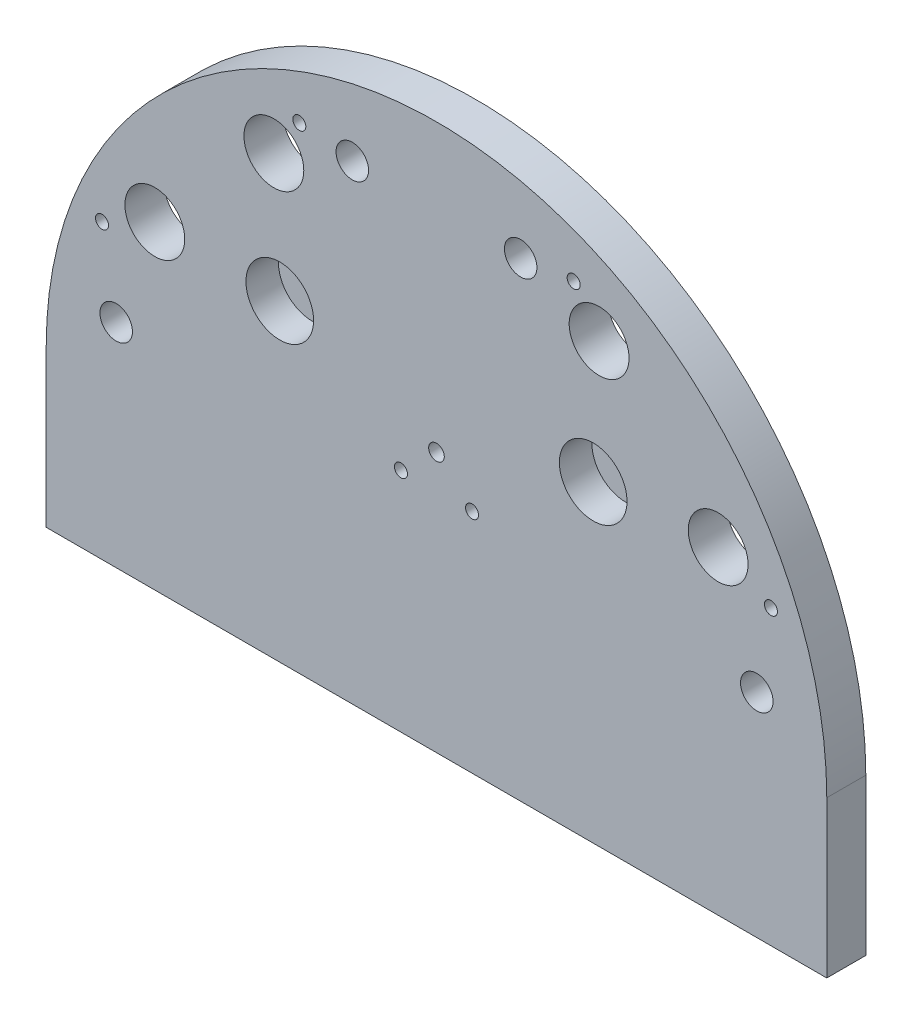
ISO-10303-21;
HEADER;
FILE_DESCRIPTION(('STEP AP214'),'2;1');
FILE_NAME('part.step','',(''),(''),'','','');
FILE_SCHEMA(('AUTOMOTIVE_DESIGN { 1 0 10303 214 1 1 1 1 }'));
ENDSEC;
DATA;
#1=APPLICATION_CONTEXT('core data for automotive mechanical design processes');
#2=APPLICATION_PROTOCOL_DEFINITION('international standard','automotive_design',2000,#1);
#3=PRODUCT_CONTEXT('',#1,'mechanical');
#4=PRODUCT('Part','Part','',(#3));
#5=PRODUCT_RELATED_PRODUCT_CATEGORY('part','',(#4));
#6=PRODUCT_DEFINITION_FORMATION('','',#4);
#7=PRODUCT_DEFINITION_CONTEXT('part definition',#1,'design');
#8=PRODUCT_DEFINITION('design','',#6,#7);
#9=PRODUCT_DEFINITION_SHAPE('','',#8);
#10=(LENGTH_UNIT() NAMED_UNIT(*) SI_UNIT(.MILLI.,.METRE.));
#11=(NAMED_UNIT(*) PLANE_ANGLE_UNIT() SI_UNIT($,.RADIAN.));
#12=(NAMED_UNIT(*) SI_UNIT($,.STERADIAN.) SOLID_ANGLE_UNIT());
#13=UNCERTAINTY_MEASURE_WITH_UNIT(LENGTH_MEASURE(1.E-05),#10,'distance_accuracy_value','');
#14=(GEOMETRIC_REPRESENTATION_CONTEXT(3) GLOBAL_UNCERTAINTY_ASSIGNED_CONTEXT((#13)) GLOBAL_UNIT_ASSIGNED_CONTEXT((#10,
#11,#12)) REPRESENTATION_CONTEXT('',''));
#15=CARTESIAN_POINT('',(0.,0.,0.));
#16=DIRECTION('',(0.,0.,1.));
#17=DIRECTION('',(1.,0.,0.));
#18=AXIS2_PLACEMENT_3D('',#15,#16,#17);
#19=CARTESIAN_POINT('',(120.47,120.47,-0.001000000000001));
#20=DIRECTION('',(0.,0.,1.));
#21=DIRECTION('',(1.,0.,0.));
#22=AXIS2_PLACEMENT_3D('',#19,#20,#21);
#23=CYLINDRICAL_SURFACE('',#22,26.);
#24=CARTESIAN_POINT('',(120.47,120.47,30.));
#25=DIRECTION('',(0.,0.,1.));
#26=DIRECTION('',(-1.,0.,0.));
#27=AXIS2_PLACEMENT_3D('',#24,#25,#26);
#28=CIRCLE('',#27,26.);
#29=CARTESIAN_POINT('',(94.47,120.47,30.));
#30=VERTEX_POINT('',#29);
#31=EDGE_CURVE('E348',#30,#30,#28,.T.);
#32=ORIENTED_EDGE('',*,*,#31,.T.);
#33=EDGE_LOOP('',(#32));
#34=FACE_BOUND('',#33,.T.);
#35=CARTESIAN_POINT('',(120.47,120.47,5.));
#36=DIRECTION('',(0.,0.,-1.));
#37=DIRECTION('',(-1.,0.,0.));
#38=AXIS2_PLACEMENT_3D('',#35,#36,#37);
#39=CIRCLE('',#38,26.);
#40=CARTESIAN_POINT('',(94.47,120.47,5.));
#41=VERTEX_POINT('',#40);
#42=EDGE_CURVE('E11',#41,#41,#39,.F.);
#43=ORIENTED_EDGE('',*,*,#42,.F.);
#44=EDGE_LOOP('',(#43));
#45=FACE_BOUND('',#44,.T.);
#46=ADVANCED_FACE('F41',(#34,#45),#23,.F.);
#47=CARTESIAN_POINT('',(-120.47,120.47,-0.001000000000001));
#48=DIRECTION('',(0.,0.,1.));
#49=DIRECTION('',(1.,0.,0.));
#50=AXIS2_PLACEMENT_3D('',#47,#48,#49);
#51=CYLINDRICAL_SURFACE('',#50,26.);
#52=CARTESIAN_POINT('',(-120.47,120.47,30.));
#53=DIRECTION('',(0.,0.,1.));
#54=DIRECTION('',(1.,0.,0.));
#55=AXIS2_PLACEMENT_3D('',#52,#53,#54);
#56=CIRCLE('',#55,26.);
#57=CARTESIAN_POINT('',(-94.47,120.47,30.));
#58=VERTEX_POINT('',#57);
#59=EDGE_CURVE('E93',#58,#58,#56,.T.);
#60=ORIENTED_EDGE('',*,*,#59,.T.);
#61=EDGE_LOOP('',(#60));
#62=FACE_BOUND('',#61,.T.);
#63=CARTESIAN_POINT('',(-120.47,120.47,5.));
#64=DIRECTION('',(0.,0.,-1.));
#65=DIRECTION('',(-1.,0.,0.));
#66=AXIS2_PLACEMENT_3D('',#63,#64,#65);
#67=CIRCLE('',#66,26.);
#68=CARTESIAN_POINT('',(-146.47,120.47,5.));
#69=VERTEX_POINT('',#68);
#70=EDGE_CURVE('E51',#69,#69,#67,.F.);
#71=ORIENTED_EDGE('',*,*,#70,.F.);
#72=EDGE_LOOP('',(#71));
#73=FACE_BOUND('',#72,.T.);
#74=ADVANCED_FACE('F146',(#62,#73),#51,.F.);
#75=CARTESIAN_POINT('',(0.,0.,30.));
#76=DIRECTION('',(0.,0.,-1.));
#77=DIRECTION('',(-1.,0.,0.));
#78=AXIS2_PLACEMENT_3D('',#75,#76,#77);
#79=CYLINDRICAL_SURFACE('',#78,300.);
#80=CARTESIAN_POINT('',(0.,0.,30.));
#81=DIRECTION('',(0.,0.,1.));
#82=DIRECTION('',(1.,0.,0.));
#83=AXIS2_PLACEMENT_3D('',#80,#81,#82);
#84=CIRCLE('',#83,300.);
#85=CARTESIAN_POINT('',(300.,0.,30.));
#86=VERTEX_POINT('',#85);
#87=CARTESIAN_POINT('',(-300.,0.,30.));
#88=VERTEX_POINT('',#87);
#89=EDGE_CURVE('E99',#86,#88,#84,.T.);
#90=ORIENTED_EDGE('',*,*,#89,.F.);
#91=DIRECTION('',(0.,0.,1.));
#92=VECTOR('',#91,1.);
#93=CARTESIAN_POINT('',(300.,0.,-611.882341631134));
#94=LINE('',#93,#92);
#95=CARTESIAN_POINT('',(300.,0.,0.));
#96=VERTEX_POINT('',#95);
#97=EDGE_CURVE('E336',#96,#86,#94,.T.);
#98=ORIENTED_EDGE('',*,*,#97,.F.);
#99=CARTESIAN_POINT('',(0.,0.,0.));
#100=DIRECTION('',(0.,0.,1.));
#101=DIRECTION('',(1.,0.,0.));
#102=AXIS2_PLACEMENT_3D('',#99,#100,#101);
#103=CIRCLE('',#102,300.);
#104=CARTESIAN_POINT('',(-300.,0.,0.));
#105=VERTEX_POINT('',#104);
#106=EDGE_CURVE('E100',#96,#105,#103,.T.);
#107=ORIENTED_EDGE('',*,*,#106,.T.);
#108=DIRECTION('',(0.,0.,1.));
#109=VECTOR('',#108,1.);
#110=CARTESIAN_POINT('',(-300.,0.,-611.882341631134));
#111=LINE('',#110,#109);
#112=EDGE_CURVE('E83',#105,#88,#111,.T.);
#113=ORIENTED_EDGE('',*,*,#112,.T.);
#114=EDGE_LOOP('',(#90,#98,#107,#113));
#115=FACE_BOUND('',#114,.T.);
#116=ADVANCED_FACE('F97',(#115),#79,.T.);
#117=CARTESIAN_POINT('',(216.50635094611,124.999999999999,30.));
#118=DIRECTION('',(0.,0.,-1.));
#119=DIRECTION('',(-1.,0.,0.));
#120=AXIS2_PLACEMENT_3D('',#117,#118,#119);
#121=CYLINDRICAL_SURFACE('',#120,23.);
#122=CARTESIAN_POINT('',(216.50635094611,124.999999999999,30.));
#123=DIRECTION('',(0.,0.,1.));
#124=DIRECTION('',(1.,0.,0.));
#125=AXIS2_PLACEMENT_3D('',#122,#123,#124);
#126=CIRCLE('',#125,23.);
#127=CARTESIAN_POINT('',(239.50635094611,124.999999999999,30.));
#128=VERTEX_POINT('',#127);
#129=EDGE_CURVE('E110',#128,#128,#126,.F.);
#130=ORIENTED_EDGE('',*,*,#129,.F.);
#131=EDGE_LOOP('',(#130));
#132=FACE_BOUND('',#131,.T.);
#133=CARTESIAN_POINT('',(216.50635094611,124.999999999999,0.));
#134=DIRECTION('',(0.,0.,1.));
#135=DIRECTION('',(1.,0.,0.));
#136=AXIS2_PLACEMENT_3D('',#133,#134,#135);
#137=CIRCLE('',#136,23.);
#138=CARTESIAN_POINT('',(239.50635094611,124.999999999999,0.));
#139=VERTEX_POINT('',#138);
#140=EDGE_CURVE('E130',#139,#139,#137,.F.);
#141=ORIENTED_EDGE('',*,*,#140,.T.);
#142=EDGE_LOOP('',(#141));
#143=FACE_BOUND('',#142,.T.);
#144=ADVANCED_FACE('F154',(#132,#143),#121,.F.);
#145=CARTESIAN_POINT('',(-125.,216.50635094611,30.));
#146=DIRECTION('',(0.,0.,-1.));
#147=DIRECTION('',(-1.,0.,0.));
#148=AXIS2_PLACEMENT_3D('',#145,#146,#147);
#149=CYLINDRICAL_SURFACE('',#148,23.);
#150=CARTESIAN_POINT('',(-125.,216.50635094611,30.));
#151=DIRECTION('',(0.,0.,1.));
#152=DIRECTION('',(1.,0.,0.));
#153=AXIS2_PLACEMENT_3D('',#150,#151,#152);
#154=CIRCLE('',#153,23.);
#155=CARTESIAN_POINT('',(-102.,216.50635094611,30.));
#156=VERTEX_POINT('',#155);
#157=EDGE_CURVE('E117',#156,#156,#154,.T.);
#158=ORIENTED_EDGE('',*,*,#157,.T.);
#159=EDGE_LOOP('',(#158));
#160=FACE_BOUND('',#159,.T.);
#161=CARTESIAN_POINT('',(-125.,216.50635094611,0.));
#162=DIRECTION('',(0.,0.,1.));
#163=DIRECTION('',(1.,0.,0.));
#164=AXIS2_PLACEMENT_3D('',#161,#162,#163);
#165=CIRCLE('',#164,23.);
#166=CARTESIAN_POINT('',(-102.,216.50635094611,0.));
#167=VERTEX_POINT('',#166);
#168=EDGE_CURVE('E125',#167,#167,#165,.T.);
#169=ORIENTED_EDGE('',*,*,#168,.F.);
#170=EDGE_LOOP('',(#169));
#171=FACE_BOUND('',#170,.T.);
#172=ADVANCED_FACE('F224',(#160,#171),#149,.F.);
#173=CARTESIAN_POINT('',(-216.50635094611,124.999999999999,30.));
#174=DIRECTION('',(0.,0.,-1.));
#175=DIRECTION('',(-1.,0.,0.));
#176=AXIS2_PLACEMENT_3D('',#173,#174,#175);
#177=CYLINDRICAL_SURFACE('',#176,22.9999999999999);
#178=CARTESIAN_POINT('',(-216.50635094611,124.999999999999,30.));
#179=DIRECTION('',(0.,0.,1.));
#180=DIRECTION('',(1.,0.,0.));
#181=AXIS2_PLACEMENT_3D('',#178,#179,#180);
#182=CIRCLE('',#181,22.9999999999999);
#183=CARTESIAN_POINT('',(-193.50635094611,124.999999999999,30.));
#184=VERTEX_POINT('',#183);
#185=EDGE_CURVE('E139',#184,#184,#182,.T.);
#186=ORIENTED_EDGE('',*,*,#185,.T.);
#187=EDGE_LOOP('',(#186));
#188=FACE_BOUND('',#187,.T.);
#189=CARTESIAN_POINT('',(-216.50635094611,124.999999999999,0.));
#190=DIRECTION('',(0.,0.,1.));
#191=DIRECTION('',(1.,0.,0.));
#192=AXIS2_PLACEMENT_3D('',#189,#190,#191);
#193=CIRCLE('',#192,22.9999999999999);
#194=CARTESIAN_POINT('',(-193.50635094611,124.999999999999,0.));
#195=VERTEX_POINT('',#194);
#196=EDGE_CURVE('E121',#195,#195,#193,.T.);
#197=ORIENTED_EDGE('',*,*,#196,.F.);
#198=EDGE_LOOP('',(#197));
#199=FACE_BOUND('',#198,.T.);
#200=ADVANCED_FACE('F43',(#188,#199),#177,.F.);
#201=CARTESIAN_POINT('',(125.,216.50635094611,30.));
#202=DIRECTION('',(0.,0.,-1.));
#203=DIRECTION('',(-1.,0.,0.));
#204=AXIS2_PLACEMENT_3D('',#201,#202,#203);
#205=CYLINDRICAL_SURFACE('',#204,23.);
#206=CARTESIAN_POINT('',(125.,216.50635094611,30.));
#207=DIRECTION('',(0.,0.,1.));
#208=DIRECTION('',(1.,0.,0.));
#209=AXIS2_PLACEMENT_3D('',#206,#207,#208);
#210=CIRCLE('',#209,23.);
#211=CARTESIAN_POINT('',(148.,216.50635094611,30.));
#212=VERTEX_POINT('',#211);
#213=EDGE_CURVE('E109',#212,#212,#210,.F.);
#214=ORIENTED_EDGE('',*,*,#213,.F.);
#215=EDGE_LOOP('',(#214));
#216=FACE_BOUND('',#215,.T.);
#217=CARTESIAN_POINT('',(125.,216.50635094611,0.));
#218=DIRECTION('',(0.,0.,1.));
#219=DIRECTION('',(1.,0.,0.));
#220=AXIS2_PLACEMENT_3D('',#217,#218,#219);
#221=CIRCLE('',#220,23.);
#222=CARTESIAN_POINT('',(148.,216.50635094611,0.));
#223=VERTEX_POINT('',#222);
#224=EDGE_CURVE('E136',#223,#223,#221,.F.);
#225=ORIENTED_EDGE('',*,*,#224,.T.);
#226=EDGE_LOOP('',(#225));
#227=FACE_BOUND('',#226,.T.);
#228=ADVANCED_FACE('F215',(#216,#227),#205,.F.);
#229=CARTESIAN_POINT('',(0.,0.,30.));
#230=DIRECTION('',(0.,0.,1.));
#231=DIRECTION('',(1.,0.,0.));
#232=AXIS2_PLACEMENT_3D('',#229,#230,#231);
#233=PLANE('',#232);
#234=CARTESIAN_POINT('',(0.,80.,30.));
#235=DIRECTION('',(0.,0.,1.));
#236=DIRECTION('',(1.,0.,0.));
#237=AXIS2_PLACEMENT_3D('',#234,#235,#236);
#238=CIRCLE('',#237,6.);
#239=CARTESIAN_POINT('',(6.,80.,30.));
#240=VERTEX_POINT('',#239);
#241=EDGE_CURVE('E352',#240,#240,#238,.T.);
#242=ORIENTED_EDGE('',*,*,#241,.F.);
#243=EDGE_LOOP('',(#242));
#244=FACE_BOUND('',#243,.T.);
#245=ORIENTED_EDGE('',*,*,#59,.F.);
#246=EDGE_LOOP('',(#245));
#247=FACE_BOUND('',#246,.T.);
#248=ORIENTED_EDGE('',*,*,#31,.F.);
#249=EDGE_LOOP('',(#248));
#250=FACE_BOUND('',#249,.T.);
#251=DIRECTION('',(0.,1.,0.));
#252=VECTOR('',#251,1.);
#253=CARTESIAN_POINT('',(300.,-120.,30.));
#254=LINE('',#253,#252);
#255=CARTESIAN_POINT('',(300.,-120.,30.));
#256=VERTEX_POINT('',#255);
#257=EDGE_CURVE('E102',#256,#86,#254,.T.);
#258=ORIENTED_EDGE('',*,*,#257,.T.);
#259=ORIENTED_EDGE('',*,*,#89,.T.);
#260=DIRECTION('',(0.,-1.,0.));
#261=VECTOR('',#260,1.);
#262=CARTESIAN_POINT('',(-300.,0.,30.));
#263=LINE('',#262,#261);
#264=CARTESIAN_POINT('',(-300.,-120.,30.));
#265=VERTEX_POINT('',#264);
#266=EDGE_CURVE('E79',#88,#265,#263,.T.);
#267=ORIENTED_EDGE('',*,*,#266,.T.);
#268=DIRECTION('',(1.,0.,0.));
#269=VECTOR('',#268,1.);
#270=CARTESIAN_POINT('',(-300.,-120.,30.));
#271=LINE('',#270,#269);
#272=EDGE_CURVE('E92',#265,#256,#271,.T.);
#273=ORIENTED_EDGE('',*,*,#272,.T.);
#274=EDGE_LOOP('',(#258,#259,#267,#273));
#275=FACE_BOUND('',#274,.T.);
#276=CARTESIAN_POINT('',(-257.08128677489,104.872747052942,30.));
#277=DIRECTION('',(0.,0.,1.));
#278=DIRECTION('',(1.,0.,0.));
#279=AXIS2_PLACEMENT_3D('',#276,#277,#278);
#280=CIRCLE('',#279,4.99999999998269);
#281=CARTESIAN_POINT('',(-252.081286774907,104.872747052942,30.));
#282=VERTEX_POINT('',#281);
#283=EDGE_CURVE('E322',#282,#282,#280,.T.);
#284=ORIENTED_EDGE('',*,*,#283,.F.);
#285=EDGE_LOOP('',(#284));
#286=FACE_BOUND('',#285,.T.);
#287=CARTESIAN_POINT('',(-105.443118666605,246.486099917694,30.));
#288=DIRECTION('',(0.,0.,1.));
#289=DIRECTION('',(1.,0.,0.));
#290=AXIS2_PLACEMENT_3D('',#287,#288,#289);
#291=CIRCLE('',#290,4.99999999998266);
#292=CARTESIAN_POINT('',(-100.443118666623,246.486099917694,30.));
#293=VERTEX_POINT('',#292);
#294=EDGE_CURVE('E314',#293,#293,#291,.T.);
#295=ORIENTED_EDGE('',*,*,#294,.F.);
#296=EDGE_LOOP('',(#295));
#297=FACE_BOUND('',#296,.T.);
#298=CARTESIAN_POINT('',(-27.3266924233566,54.2718973003634,30.));
#299=DIRECTION('',(0.,0.,1.));
#300=DIRECTION('',(1.,0.,0.));
#301=AXIS2_PLACEMENT_3D('',#298,#299,#300);
#302=CIRCLE('',#301,4.99999999998266);
#303=CARTESIAN_POINT('',(-22.3266924233739,54.2718973003634,30.));
#304=VERTEX_POINT('',#303);
#305=EDGE_CURVE('E306',#304,#304,#302,.T.);
#306=ORIENTED_EDGE('',*,*,#305,.F.);
#307=EDGE_LOOP('',(#306));
#308=FACE_BOUND('',#307,.T.);
#309=CARTESIAN_POINT('',(27.3266924233566,54.2718973003634,30.));
#310=DIRECTION('',(0.,0.,1.));
#311=DIRECTION('',(-1.,0.,0.));
#312=AXIS2_PLACEMENT_3D('',#309,#310,#311);
#313=CIRCLE('',#312,4.99999999998266);
#314=CARTESIAN_POINT('',(22.3266924233739,54.2718973003634,30.));
#315=VERTEX_POINT('',#314);
#316=EDGE_CURVE('E298',#315,#315,#313,.T.);
#317=ORIENTED_EDGE('',*,*,#316,.F.);
#318=EDGE_LOOP('',(#317));
#319=FACE_BOUND('',#318,.T.);
#320=CARTESIAN_POINT('',(105.443118666605,246.486099917694,30.));
#321=DIRECTION('',(0.,0.,1.));
#322=DIRECTION('',(-1.,0.,0.));
#323=AXIS2_PLACEMENT_3D('',#320,#321,#322);
#324=CIRCLE('',#323,4.99999999998266);
#325=CARTESIAN_POINT('',(100.443118666623,246.486099917694,30.));
#326=VERTEX_POINT('',#325);
#327=EDGE_CURVE('E290',#326,#326,#324,.T.);
#328=ORIENTED_EDGE('',*,*,#327,.F.);
#329=EDGE_LOOP('',(#328));
#330=FACE_BOUND('',#329,.T.);
#331=CARTESIAN_POINT('',(257.08128677489,104.872747052942,30.));
#332=DIRECTION('',(0.,0.,1.));
#333=DIRECTION('',(-1.,0.,0.));
#334=AXIS2_PLACEMENT_3D('',#331,#332,#333);
#335=CIRCLE('',#334,4.99999999998269);
#336=CARTESIAN_POINT('',(252.081286774907,104.872747052942,30.));
#337=VERTEX_POINT('',#336);
#338=EDGE_CURVE('E281',#337,#337,#335,.T.);
#339=ORIENTED_EDGE('',*,*,#338,.F.);
#340=EDGE_LOOP('',(#339));
#341=FACE_BOUND('',#340,.T.);
#342=CARTESIAN_POINT('',(-246.201938253052,43.4120444167327,30.));
#343=DIRECTION('',(0.,0.,1.));
#344=DIRECTION('',(1.,0.,0.));
#345=AXIS2_PLACEMENT_3D('',#342,#343,#344);
#346=CIRCLE('',#345,12.5);
#347=CARTESIAN_POINT('',(-233.701938253052,43.4120444167327,30.));
#348=VERTEX_POINT('',#347);
#349=EDGE_CURVE('E266',#348,#348,#346,.T.);
#350=ORIENTED_EDGE('',*,*,#349,.F.);
#351=EDGE_LOOP('',(#350));
#352=FACE_BOUND('',#351,.T.);
#353=CARTESIAN_POINT('',(64.7047612756304,241.481456572267,30.));
#354=DIRECTION('',(0.,0.,1.));
#355=DIRECTION('',(-1.,0.,0.));
#356=AXIS2_PLACEMENT_3D('',#353,#354,#355);
#357=CIRCLE('',#356,12.5);
#358=CARTESIAN_POINT('',(52.2047612756304,241.481456572267,30.));
#359=VERTEX_POINT('',#358);
#360=EDGE_CURVE('E267',#359,#359,#357,.T.);
#361=ORIENTED_EDGE('',*,*,#360,.F.);
#362=EDGE_LOOP('',(#361));
#363=FACE_BOUND('',#362,.T.);
#364=CARTESIAN_POINT('',(-64.7047612756304,241.481456572267,30.));
#365=DIRECTION('',(0.,0.,1.));
#366=DIRECTION('',(1.,0.,0.));
#367=AXIS2_PLACEMENT_3D('',#364,#365,#366);
#368=CIRCLE('',#367,12.5);
#369=CARTESIAN_POINT('',(-52.2047612756304,241.481456572267,30.));
#370=VERTEX_POINT('',#369);
#371=EDGE_CURVE('E249',#370,#370,#368,.T.);
#372=ORIENTED_EDGE('',*,*,#371,.F.);
#373=EDGE_LOOP('',(#372));
#374=FACE_BOUND('',#373,.T.);
#375=CARTESIAN_POINT('',(246.201938253052,43.4120444167327,30.));
#376=DIRECTION('',(0.,0.,1.));
#377=DIRECTION('',(-1.,0.,0.));
#378=AXIS2_PLACEMENT_3D('',#375,#376,#377);
#379=CIRCLE('',#378,12.5);
#380=CARTESIAN_POINT('',(233.701938253052,43.4120444167327,30.));
#381=VERTEX_POINT('',#380);
#382=EDGE_CURVE('E258',#381,#381,#379,.T.);
#383=ORIENTED_EDGE('',*,*,#382,.F.);
#384=EDGE_LOOP('',(#383));
#385=FACE_BOUND('',#384,.T.);
#386=ORIENTED_EDGE('',*,*,#185,.F.);
#387=EDGE_LOOP('',(#386));
#388=FACE_BOUND('',#387,.T.);
#389=ORIENTED_EDGE('',*,*,#157,.F.);
#390=EDGE_LOOP('',(#389));
#391=FACE_BOUND('',#390,.T.);
#392=ORIENTED_EDGE('',*,*,#129,.T.);
#393=EDGE_LOOP('',(#392));
#394=FACE_BOUND('',#393,.T.);
#395=ORIENTED_EDGE('',*,*,#213,.T.);
#396=EDGE_LOOP('',(#395));
#397=FACE_BOUND('',#396,.T.);
#398=ADVANCED_FACE('F105',(#244,#247,#250,#275,#286,#297,#308,#319,#330,#341,#352,#363,#374,
#385,#388,#391,#394,#397),#233,.T.);
#399=CARTESIAN_POINT('',(0.,0.,0.));
#400=DIRECTION('',(0.,0.,1.));
#401=DIRECTION('',(1.,0.,0.));
#402=AXIS2_PLACEMENT_3D('',#399,#400,#401);
#403=PLANE('',#402);
#404=CARTESIAN_POINT('',(0.,80.,0.));
#405=DIRECTION('',(0.,0.,-1.));
#406=DIRECTION('',(-1.,0.,0.));
#407=AXIS2_PLACEMENT_3D('',#404,#405,#406);
#408=CIRCLE('',#407,6.);
#409=CARTESIAN_POINT('',(-6.,80.,0.));
#410=VERTEX_POINT('',#409);
#411=EDGE_CURVE('E358',#410,#410,#408,.T.);
#412=ORIENTED_EDGE('',*,*,#411,.F.);
#413=EDGE_LOOP('',(#412));
#414=FACE_BOUND('',#413,.T.);
#415=ORIENTED_EDGE('',*,*,#106,.F.);
#416=DIRECTION('',(0.,-1.,0.));
#417=VECTOR('',#416,1.);
#418=CARTESIAN_POINT('',(300.,-120.,0.));
#419=LINE('',#418,#417);
#420=CARTESIAN_POINT('',(300.,-120.,0.));
#421=VERTEX_POINT('',#420);
#422=EDGE_CURVE('E57',#96,#421,#419,.T.);
#423=ORIENTED_EDGE('',*,*,#422,.T.);
#424=DIRECTION('',(-1.,0.,0.));
#425=VECTOR('',#424,1.);
#426=CARTESIAN_POINT('',(-300.,-120.,0.));
#427=LINE('',#426,#425);
#428=CARTESIAN_POINT('',(-300.,-120.,0.));
#429=VERTEX_POINT('',#428);
#430=EDGE_CURVE('E339',#421,#429,#427,.T.);
#431=ORIENTED_EDGE('',*,*,#430,.T.);
#432=DIRECTION('',(0.,1.,0.));
#433=VECTOR('',#432,1.);
#434=CARTESIAN_POINT('',(-300.,0.,0.));
#435=LINE('',#434,#433);
#436=EDGE_CURVE('E286',#429,#105,#435,.T.);
#437=ORIENTED_EDGE('',*,*,#436,.T.);
#438=EDGE_LOOP('',(#415,#423,#431,#437));
#439=FACE_BOUND('',#438,.T.);
#440=CARTESIAN_POINT('',(-257.08128677489,104.872747052942,0.));
#441=DIRECTION('',(0.,0.,1.));
#442=DIRECTION('',(1.,0.,0.));
#443=AXIS2_PLACEMENT_3D('',#440,#441,#442);
#444=CIRCLE('',#443,4.99999999998269);
#445=CARTESIAN_POINT('',(-252.081286774907,104.872747052942,0.));
#446=VERTEX_POINT('',#445);
#447=EDGE_CURVE('E271',#446,#446,#444,.T.);
#448=ORIENTED_EDGE('',*,*,#447,.T.);
#449=EDGE_LOOP('',(#448));
#450=FACE_BOUND('',#449,.T.);
#451=CARTESIAN_POINT('',(-105.443118666605,246.486099917694,0.));
#452=DIRECTION('',(0.,0.,1.));
#453=DIRECTION('',(1.,0.,0.));
#454=AXIS2_PLACEMENT_3D('',#451,#452,#453);
#455=CIRCLE('',#454,4.99999999998266);
#456=CARTESIAN_POINT('',(-100.443118666623,246.486099917694,0.));
#457=VERTEX_POINT('',#456);
#458=EDGE_CURVE('E318',#457,#457,#455,.T.);
#459=ORIENTED_EDGE('',*,*,#458,.T.);
#460=EDGE_LOOP('',(#459));
#461=FACE_BOUND('',#460,.T.);
#462=CARTESIAN_POINT('',(-27.3266924233566,54.2718973003634,0.));
#463=DIRECTION('',(0.,0.,1.));
#464=DIRECTION('',(1.,0.,0.));
#465=AXIS2_PLACEMENT_3D('',#462,#463,#464);
#466=CIRCLE('',#465,4.99999999998266);
#467=CARTESIAN_POINT('',(-22.3266924233739,54.2718973003634,0.));
#468=VERTEX_POINT('',#467);
#469=EDGE_CURVE('E310',#468,#468,#466,.T.);
#470=ORIENTED_EDGE('',*,*,#469,.T.);
#471=EDGE_LOOP('',(#470));
#472=FACE_BOUND('',#471,.T.);
#473=CARTESIAN_POINT('',(27.3266924233566,54.2718973003634,0.));
#474=DIRECTION('',(0.,0.,1.));
#475=DIRECTION('',(-1.,0.,0.));
#476=AXIS2_PLACEMENT_3D('',#473,#474,#475);
#477=CIRCLE('',#476,4.99999999998266);
#478=CARTESIAN_POINT('',(22.3266924233739,54.2718973003634,0.));
#479=VERTEX_POINT('',#478);
#480=EDGE_CURVE('E302',#479,#479,#477,.T.);
#481=ORIENTED_EDGE('',*,*,#480,.T.);
#482=EDGE_LOOP('',(#481));
#483=FACE_BOUND('',#482,.T.);
#484=CARTESIAN_POINT('',(105.443118666605,246.486099917694,0.));
#485=DIRECTION('',(0.,0.,1.));
#486=DIRECTION('',(-1.,0.,0.));
#487=AXIS2_PLACEMENT_3D('',#484,#485,#486);
#488=CIRCLE('',#487,4.99999999998266);
#489=CARTESIAN_POINT('',(100.443118666623,246.486099917694,0.));
#490=VERTEX_POINT('',#489);
#491=EDGE_CURVE('E294',#490,#490,#488,.T.);
#492=ORIENTED_EDGE('',*,*,#491,.T.);
#493=EDGE_LOOP('',(#492));
#494=FACE_BOUND('',#493,.T.);
#495=CARTESIAN_POINT('',(257.08128677489,104.872747052942,0.));
#496=DIRECTION('',(0.,0.,1.));
#497=DIRECTION('',(-1.,0.,0.));
#498=AXIS2_PLACEMENT_3D('',#495,#496,#497);
#499=CIRCLE('',#498,4.99999999998269);
#500=CARTESIAN_POINT('',(252.081286774907,104.872747052942,0.));
#501=VERTEX_POINT('',#500);
#502=EDGE_CURVE('E285',#501,#501,#499,.T.);
#503=ORIENTED_EDGE('',*,*,#502,.T.);
#504=EDGE_LOOP('',(#503));
#505=FACE_BOUND('',#504,.T.);
#506=CARTESIAN_POINT('',(-246.201938253052,43.4120444167327,0.));
#507=DIRECTION('',(0.,0.,1.));
#508=DIRECTION('',(1.,0.,0.));
#509=AXIS2_PLACEMENT_3D('',#506,#507,#508);
#510=CIRCLE('',#509,12.5);
#511=CARTESIAN_POINT('',(-233.701938253052,43.4120444167327,0.));
#512=VERTEX_POINT('',#511);
#513=EDGE_CURVE('E126',#512,#512,#510,.T.);
#514=ORIENTED_EDGE('',*,*,#513,.T.);
#515=EDGE_LOOP('',(#514));
#516=FACE_BOUND('',#515,.T.);
#517=CARTESIAN_POINT('',(64.7047612756304,241.481456572267,0.));
#518=DIRECTION('',(0.,0.,1.));
#519=DIRECTION('',(-1.,0.,0.));
#520=AXIS2_PLACEMENT_3D('',#517,#518,#519);
#521=CIRCLE('',#520,12.5);
#522=CARTESIAN_POINT('',(52.2047612756304,241.481456572267,0.));
#523=VERTEX_POINT('',#522);
#524=EDGE_CURVE('E254',#523,#523,#521,.T.);
#525=ORIENTED_EDGE('',*,*,#524,.T.);
#526=EDGE_LOOP('',(#525));
#527=FACE_BOUND('',#526,.T.);
#528=CARTESIAN_POINT('',(-64.7047612756304,241.481456572267,0.));
#529=DIRECTION('',(0.,0.,1.));
#530=DIRECTION('',(1.,0.,0.));
#531=AXIS2_PLACEMENT_3D('',#528,#529,#530);
#532=CIRCLE('',#531,12.5);
#533=CARTESIAN_POINT('',(-52.2047612756304,241.481456572267,0.));
#534=VERTEX_POINT('',#533);
#535=EDGE_CURVE('E253',#534,#534,#532,.T.);
#536=ORIENTED_EDGE('',*,*,#535,.T.);
#537=EDGE_LOOP('',(#536));
#538=FACE_BOUND('',#537,.T.);
#539=CARTESIAN_POINT('',(246.201938253052,43.4120444167327,0.));
#540=DIRECTION('',(0.,0.,1.));
#541=DIRECTION('',(-1.,0.,0.));
#542=AXIS2_PLACEMENT_3D('',#539,#540,#541);
#543=CIRCLE('',#542,12.5);
#544=CARTESIAN_POINT('',(233.701938253052,43.4120444167327,0.));
#545=VERTEX_POINT('',#544);
#546=EDGE_CURVE('E262',#545,#545,#543,.T.);
#547=ORIENTED_EDGE('',*,*,#546,.T.);
#548=EDGE_LOOP('',(#547));
#549=FACE_BOUND('',#548,.T.);
#550=ORIENTED_EDGE('',*,*,#196,.T.);
#551=EDGE_LOOP('',(#550));
#552=FACE_BOUND('',#551,.T.);
#553=ORIENTED_EDGE('',*,*,#168,.T.);
#554=EDGE_LOOP('',(#553));
#555=FACE_BOUND('',#554,.T.);
#556=ORIENTED_EDGE('',*,*,#140,.F.);
#557=EDGE_LOOP('',(#556));
#558=FACE_BOUND('',#557,.T.);
#559=ORIENTED_EDGE('',*,*,#224,.F.);
#560=EDGE_LOOP('',(#559));
#561=FACE_BOUND('',#560,.T.);
#562=ADVANCED_FACE('F208',(#414,#439,#450,#461,#472,#483,#494,#505,#516,#527,#538,#549,#552,
#555,#558,#561),#403,.F.);
#563=CARTESIAN_POINT('',(246.201938253052,43.4120444167327,0.));
#564=DIRECTION('',(0.,0.,1.));
#565=DIRECTION('',(1.,0.,0.));
#566=AXIS2_PLACEMENT_3D('',#563,#564,#565);
#567=CYLINDRICAL_SURFACE('',#566,12.5);
#568=ORIENTED_EDGE('',*,*,#546,.F.);
#569=EDGE_LOOP('',(#568));
#570=FACE_BOUND('',#569,.T.);
#571=ORIENTED_EDGE('',*,*,#382,.T.);
#572=EDGE_LOOP('',(#571));
#573=FACE_BOUND('',#572,.T.);
#574=ADVANCED_FACE('F205',(#570,#573),#567,.F.);
#575=CARTESIAN_POINT('',(-64.7047612756304,241.481456572267,0.));
#576=DIRECTION('',(0.,0.,1.));
#577=DIRECTION('',(1.,0.,0.));
#578=AXIS2_PLACEMENT_3D('',#575,#576,#577);
#579=CYLINDRICAL_SURFACE('',#578,12.5);
#580=ORIENTED_EDGE('',*,*,#535,.F.);
#581=EDGE_LOOP('',(#580));
#582=FACE_BOUND('',#581,.T.);
#583=ORIENTED_EDGE('',*,*,#371,.T.);
#584=EDGE_LOOP('',(#583));
#585=FACE_BOUND('',#584,.T.);
#586=ADVANCED_FACE('F203',(#582,#585),#579,.F.);
#587=CARTESIAN_POINT('',(64.7047612756304,241.481456572267,0.));
#588=DIRECTION('',(0.,0.,1.));
#589=DIRECTION('',(1.,0.,0.));
#590=AXIS2_PLACEMENT_3D('',#587,#588,#589);
#591=CYLINDRICAL_SURFACE('',#590,12.5);
#592=ORIENTED_EDGE('',*,*,#524,.F.);
#593=EDGE_LOOP('',(#592));
#594=FACE_BOUND('',#593,.T.);
#595=ORIENTED_EDGE('',*,*,#360,.T.);
#596=EDGE_LOOP('',(#595));
#597=FACE_BOUND('',#596,.T.);
#598=ADVANCED_FACE('F199',(#594,#597),#591,.F.);
#599=CARTESIAN_POINT('',(-246.201938253052,43.4120444167327,0.));
#600=DIRECTION('',(0.,0.,1.));
#601=DIRECTION('',(1.,0.,0.));
#602=AXIS2_PLACEMENT_3D('',#599,#600,#601);
#603=CYLINDRICAL_SURFACE('',#602,12.5);
#604=ORIENTED_EDGE('',*,*,#513,.F.);
#605=EDGE_LOOP('',(#604));
#606=FACE_BOUND('',#605,.T.);
#607=ORIENTED_EDGE('',*,*,#349,.T.);
#608=EDGE_LOOP('',(#607));
#609=FACE_BOUND('',#608,.T.);
#610=ADVANCED_FACE('F195',(#606,#609),#603,.F.);
#611=CARTESIAN_POINT('',(257.08128677489,104.872747052942,0.));
#612=DIRECTION('',(0.,0.,1.));
#613=DIRECTION('',(1.,0.,0.));
#614=AXIS2_PLACEMENT_3D('',#611,#612,#613);
#615=CYLINDRICAL_SURFACE('',#614,4.99999999998269);
#616=ORIENTED_EDGE('',*,*,#502,.F.);
#617=EDGE_LOOP('',(#616));
#618=FACE_BOUND('',#617,.T.);
#619=ORIENTED_EDGE('',*,*,#338,.T.);
#620=EDGE_LOOP('',(#619));
#621=FACE_BOUND('',#620,.T.);
#622=ADVANCED_FACE('F191',(#618,#621),#615,.F.);
#623=CARTESIAN_POINT('',(105.443118666605,246.486099917694,0.));
#624=DIRECTION('',(0.,0.,1.));
#625=DIRECTION('',(1.,0.,0.));
#626=AXIS2_PLACEMENT_3D('',#623,#624,#625);
#627=CYLINDRICAL_SURFACE('',#626,4.99999999998266);
#628=ORIENTED_EDGE('',*,*,#491,.F.);
#629=EDGE_LOOP('',(#628));
#630=FACE_BOUND('',#629,.T.);
#631=ORIENTED_EDGE('',*,*,#327,.T.);
#632=EDGE_LOOP('',(#631));
#633=FACE_BOUND('',#632,.T.);
#634=ADVANCED_FACE('F187',(#630,#633),#627,.F.);
#635=CARTESIAN_POINT('',(27.3266924233566,54.2718973003634,0.));
#636=DIRECTION('',(0.,0.,1.));
#637=DIRECTION('',(1.,0.,0.));
#638=AXIS2_PLACEMENT_3D('',#635,#636,#637);
#639=CYLINDRICAL_SURFACE('',#638,4.99999999998266);
#640=ORIENTED_EDGE('',*,*,#480,.F.);
#641=EDGE_LOOP('',(#640));
#642=FACE_BOUND('',#641,.T.);
#643=ORIENTED_EDGE('',*,*,#316,.T.);
#644=EDGE_LOOP('',(#643));
#645=FACE_BOUND('',#644,.T.);
#646=ADVANCED_FACE('F183',(#642,#645),#639,.F.);
#647=CARTESIAN_POINT('',(-27.3266924233566,54.2718973003634,0.));
#648=DIRECTION('',(0.,0.,1.));
#649=DIRECTION('',(1.,0.,0.));
#650=AXIS2_PLACEMENT_3D('',#647,#648,#649);
#651=CYLINDRICAL_SURFACE('',#650,4.99999999998266);
#652=ORIENTED_EDGE('',*,*,#469,.F.);
#653=EDGE_LOOP('',(#652));
#654=FACE_BOUND('',#653,.T.);
#655=ORIENTED_EDGE('',*,*,#305,.T.);
#656=EDGE_LOOP('',(#655));
#657=FACE_BOUND('',#656,.T.);
#658=ADVANCED_FACE('F179',(#654,#657),#651,.F.);
#659=CARTESIAN_POINT('',(-105.443118666605,246.486099917694,0.));
#660=DIRECTION('',(0.,0.,1.));
#661=DIRECTION('',(1.,0.,0.));
#662=AXIS2_PLACEMENT_3D('',#659,#660,#661);
#663=CYLINDRICAL_SURFACE('',#662,4.99999999998266);
#664=ORIENTED_EDGE('',*,*,#458,.F.);
#665=EDGE_LOOP('',(#664));
#666=FACE_BOUND('',#665,.T.);
#667=ORIENTED_EDGE('',*,*,#294,.T.);
#668=EDGE_LOOP('',(#667));
#669=FACE_BOUND('',#668,.T.);
#670=ADVANCED_FACE('F175',(#666,#669),#663,.F.);
#671=CARTESIAN_POINT('',(-257.08128677489,104.872747052942,0.));
#672=DIRECTION('',(0.,0.,1.));
#673=DIRECTION('',(1.,0.,0.));
#674=AXIS2_PLACEMENT_3D('',#671,#672,#673);
#675=CYLINDRICAL_SURFACE('',#674,4.99999999998269);
#676=ORIENTED_EDGE('',*,*,#447,.F.);
#677=EDGE_LOOP('',(#676));
#678=FACE_BOUND('',#677,.T.);
#679=ORIENTED_EDGE('',*,*,#283,.T.);
#680=EDGE_LOOP('',(#679));
#681=FACE_BOUND('',#680,.T.);
#682=ADVANCED_FACE('F166',(#678,#681),#675,.F.);
#683=CARTESIAN_POINT('',(300.,-120.,-611.882341631134));
#684=DIRECTION('',(1.,0.,0.));
#685=DIRECTION('',(0.,1.,0.));
#686=AXIS2_PLACEMENT_3D('',#683,#684,#685);
#687=PLANE('',#686);
#688=ORIENTED_EDGE('',*,*,#422,.F.);
#689=ORIENTED_EDGE('',*,*,#97,.T.);
#690=ORIENTED_EDGE('',*,*,#257,.F.);
#691=DIRECTION('',(0.,0.,1.));
#692=VECTOR('',#691,1.);
#693=CARTESIAN_POINT('',(300.,-120.,-611.882341631134));
#694=LINE('',#693,#692);
#695=EDGE_CURVE('E333',#421,#256,#694,.T.);
#696=ORIENTED_EDGE('',*,*,#695,.F.);
#697=EDGE_LOOP('',(#688,#689,#690,#696));
#698=FACE_BOUND('',#697,.T.);
#699=ADVANCED_FACE('F162',(#698),#687,.T.);
#700=CARTESIAN_POINT('',(-300.,-120.,-611.882341631134));
#701=DIRECTION('',(0.,-1.,0.));
#702=DIRECTION('',(0.,0.,-1.));
#703=AXIS2_PLACEMENT_3D('',#700,#701,#702);
#704=PLANE('',#703);
#705=ORIENTED_EDGE('',*,*,#430,.F.);
#706=ORIENTED_EDGE('',*,*,#695,.T.);
#707=ORIENTED_EDGE('',*,*,#272,.F.);
#708=DIRECTION('',(0.,0.,1.));
#709=VECTOR('',#708,1.);
#710=CARTESIAN_POINT('',(-300.,-120.,-611.882341631134));
#711=LINE('',#710,#709);
#712=EDGE_CURVE('E86',#429,#265,#711,.T.);
#713=ORIENTED_EDGE('',*,*,#712,.F.);
#714=EDGE_LOOP('',(#705,#706,#707,#713));
#715=FACE_BOUND('',#714,.T.);
#716=ADVANCED_FACE('F165',(#715),#704,.T.);
#717=CARTESIAN_POINT('',(-300.,0.,-611.882341631134));
#718=DIRECTION('',(-1.,0.,0.));
#719=DIRECTION('',(0.,-1.,0.));
#720=AXIS2_PLACEMENT_3D('',#717,#718,#719);
#721=PLANE('',#720);
#722=ORIENTED_EDGE('',*,*,#436,.F.);
#723=ORIENTED_EDGE('',*,*,#712,.T.);
#724=ORIENTED_EDGE('',*,*,#266,.F.);
#725=ORIENTED_EDGE('',*,*,#112,.F.);
#726=EDGE_LOOP('',(#722,#723,#724,#725));
#727=FACE_BOUND('',#726,.T.);
#728=ADVANCED_FACE('F82',(#727),#721,.T.);
#729=CARTESIAN_POINT('',(-120.47,120.47,5.));
#730=DIRECTION('',(0.,0.,-1.));
#731=DIRECTION('',(-1.,0.,0.));
#732=AXIS2_PLACEMENT_3D('',#729,#730,#731);
#733=PLANE('',#732);
#734=ORIENTED_EDGE('',*,*,#70,.T.);
#735=EDGE_LOOP('',(#734));
#736=FACE_BOUND('',#735,.T.);
#737=ADVANCED_FACE('F144',(#736),#733,.F.);
#738=CARTESIAN_POINT('',(120.47,120.47,5.));
#739=DIRECTION('',(0.,0.,-1.));
#740=DIRECTION('',(-1.,0.,0.));
#741=AXIS2_PLACEMENT_3D('',#738,#739,#740);
#742=PLANE('',#741);
#743=ORIENTED_EDGE('',*,*,#42,.T.);
#744=EDGE_LOOP('',(#743));
#745=FACE_BOUND('',#744,.T.);
#746=ADVANCED_FACE('F424',(#745),#742,.F.);
#747=CARTESIAN_POINT('',(0.,80.,58.));
#748=DIRECTION('',(0.,0.,-1.));
#749=DIRECTION('',(-1.,0.,0.));
#750=AXIS2_PLACEMENT_3D('',#747,#748,#749);
#751=CYLINDRICAL_SURFACE('',#750,6.);
#752=ORIENTED_EDGE('',*,*,#241,.T.);
#753=EDGE_LOOP('',(#752));
#754=FACE_BOUND('',#753,.T.);
#755=ORIENTED_EDGE('',*,*,#411,.T.);
#756=EDGE_LOOP('',(#755));
#757=FACE_BOUND('',#756,.T.);
#758=ADVANCED_FACE('F363',(#754,#757),#751,.F.);
#759=CLOSED_SHELL('',(#46,#74,#116,#144,#172,#200,#228,#398,#562,#574,#586,#598,#610,#622,#634,
#646,#658,#670,#682,#699,#716,#728,#737,#746,#758));
#760=MANIFOLD_SOLID_BREP('B2',#759);
#761=ADVANCED_BREP_SHAPE_REPRESENTATION('',(#18,#760),#14);
#762=SHAPE_DEFINITION_REPRESENTATION(#9,#761);
ENDSEC;
END-ISO-10303-21;
